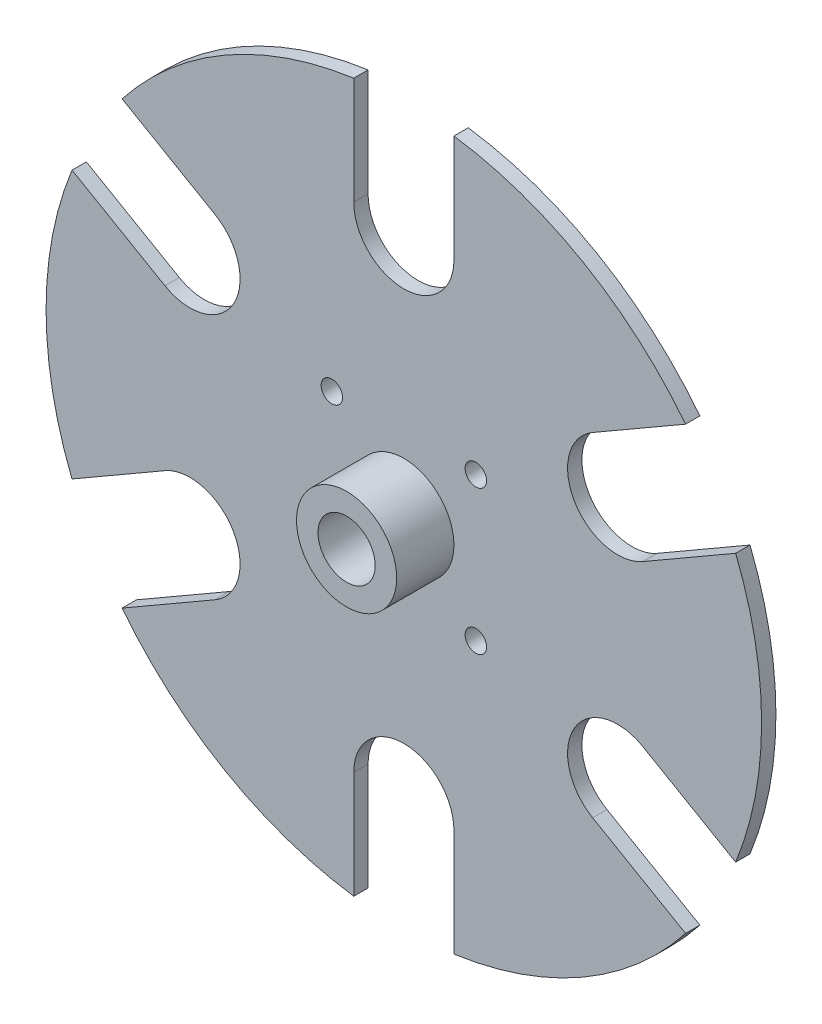
ISO-10303-21;
HEADER;
FILE_DESCRIPTION(('STEP AP214'),'2;1');
FILE_NAME('part.step','',(''),(''),'','','');
FILE_SCHEMA(('AUTOMOTIVE_DESIGN { 1 0 10303 214 1 1 1 1 }'));
ENDSEC;
DATA;
#1=APPLICATION_CONTEXT('core data for automotive mechanical design processes');
#2=APPLICATION_PROTOCOL_DEFINITION('international standard','automotive_design',2000,#1);
#3=PRODUCT_CONTEXT('',#1,'mechanical');
#4=PRODUCT('Part','Part','',(#3));
#5=PRODUCT_RELATED_PRODUCT_CATEGORY('part','',(#4));
#6=PRODUCT_DEFINITION_FORMATION('','',#4);
#7=PRODUCT_DEFINITION_CONTEXT('part definition',#1,'design');
#8=PRODUCT_DEFINITION('design','',#6,#7);
#9=PRODUCT_DEFINITION_SHAPE('','',#8);
#10=(LENGTH_UNIT() NAMED_UNIT(*) SI_UNIT(.MILLI.,.METRE.));
#11=(NAMED_UNIT(*) PLANE_ANGLE_UNIT() SI_UNIT($,.RADIAN.));
#12=(NAMED_UNIT(*) SI_UNIT($,.STERADIAN.) SOLID_ANGLE_UNIT());
#13=UNCERTAINTY_MEASURE_WITH_UNIT(LENGTH_MEASURE(1.E-05),#10,'distance_accuracy_value','');
#14=(GEOMETRIC_REPRESENTATION_CONTEXT(3) GLOBAL_UNCERTAINTY_ASSIGNED_CONTEXT((#13)) GLOBAL_UNIT_ASSIGNED_CONTEXT((#10,
#11,#12)) REPRESENTATION_CONTEXT('',''));
#15=CARTESIAN_POINT('',(0.,0.,0.));
#16=DIRECTION('',(0.,0.,1.));
#17=DIRECTION('',(1.,0.,0.));
#18=AXIS2_PLACEMENT_3D('',#15,#16,#17);
#19=CARTESIAN_POINT('',(0.,0.,7.));
#20=DIRECTION('',(0.,0.,-1.));
#21=DIRECTION('',(-1.,0.,0.));
#22=AXIS2_PLACEMENT_3D('',#19,#20,#21);
#23=CYLINDRICAL_SURFACE('',#22,50.);
#24=CARTESIAN_POINT('',(0.,0.,5.));
#25=DIRECTION('',(0.,0.,1.));
#26=DIRECTION('',(1.,0.,0.));
#27=AXIS2_PLACEMENT_3D('',#24,#25,#26);
#28=CIRCLE('',#27,50.);
#29=CARTESIAN_POINT('',(46.3748177838693,-18.6916097624823,5.));
#30=VERTEX_POINT('',#29);
#31=CARTESIAN_POINT('',(46.3748177838694,18.6916097624819,5.));
#32=VERTEX_POINT('',#31);
#33=EDGE_CURVE('E220',#30,#32,#28,.T.);
#34=ORIENTED_EDGE('',*,*,#33,.T.);
#35=DIRECTION('',(0.,0.,1.));
#36=VECTOR('',#35,1.);
#37=CARTESIAN_POINT('',(46.3748177838694,18.6916097624819,5.));
#38=LINE('',#37,#36);
#39=CARTESIAN_POINT('',(46.3748177838694,18.6916097624819,7.));
#40=VERTEX_POINT('',#39);
#41=EDGE_CURVE('E373',#32,#40,#38,.T.);
#42=ORIENTED_EDGE('',*,*,#41,.T.);
#43=CARTESIAN_POINT('',(0.,0.,7.));
#44=DIRECTION('',(0.,0.,1.));
#45=DIRECTION('',(1.,0.,0.));
#46=AXIS2_PLACEMENT_3D('',#43,#44,#45);
#47=CIRCLE('',#46,50.);
#48=CARTESIAN_POINT('',(46.3748177838693,-18.6916097624823,7.));
#49=VERTEX_POINT('',#48);
#50=EDGE_CURVE('E236',#49,#40,#47,.T.);
#51=ORIENTED_EDGE('',*,*,#50,.F.);
#52=DIRECTION('',(0.,0.,1.));
#53=VECTOR('',#52,1.);
#54=CARTESIAN_POINT('',(46.3748177838693,-18.6916097624823,5.));
#55=LINE('',#54,#53);
#56=EDGE_CURVE('E58',#30,#49,#55,.T.);
#57=ORIENTED_EDGE('',*,*,#56,.F.);
#58=EDGE_LOOP('',(#34,#42,#51,#57));
#59=FACE_BOUND('',#58,.T.);
#60=ADVANCED_FACE('F33',(#59),#23,.T.);
#61=CARTESIAN_POINT('',(6.99999999999966,-49.5075751779463,5.));
#62=VERTEX_POINT('',#61);
#63=CARTESIAN_POINT('',(39.3748177838692,-30.8159654154644,5.));
#64=VERTEX_POINT('',#63);
#65=EDGE_CURVE('E225',#62,#64,#28,.T.);
#66=ORIENTED_EDGE('',*,*,#65,.T.);
#67=DIRECTION('',(0.,0.,1.));
#68=VECTOR('',#67,1.);
#69=CARTESIAN_POINT('',(39.3748177838692,-30.8159654154644,5.));
#70=LINE('',#69,#68);
#71=CARTESIAN_POINT('',(39.3748177838692,-30.8159654154644,7.));
#72=VERTEX_POINT('',#71);
#73=EDGE_CURVE('E256',#64,#72,#70,.T.);
#74=ORIENTED_EDGE('',*,*,#73,.T.);
#75=CARTESIAN_POINT('',(6.99999999999966,-49.5075751779463,7.));
#76=VERTEX_POINT('',#75);
#77=EDGE_CURVE('E395',#76,#72,#47,.T.);
#78=ORIENTED_EDGE('',*,*,#77,.F.);
#79=DIRECTION('',(0.,0.,1.));
#80=VECTOR('',#79,1.);
#81=CARTESIAN_POINT('',(6.99999999999966,-49.5075751779463,5.));
#82=LINE('',#81,#80);
#83=EDGE_CURVE('E258',#62,#76,#82,.T.);
#84=ORIENTED_EDGE('',*,*,#83,.F.);
#85=EDGE_LOOP('',(#66,#74,#78,#84));
#86=FACE_BOUND('',#85,.T.);
#87=ADVANCED_FACE('F254',(#86),#23,.T.);
#88=CARTESIAN_POINT('',(-39.3748177838696,-30.8159654154638,5.));
#89=VERTEX_POINT('',#88);
#90=CARTESIAN_POINT('',(-7.00000000000035,-49.5075751779462,5.));
#91=VERTEX_POINT('',#90);
#92=EDGE_CURVE('E239',#89,#91,#28,.T.);
#93=ORIENTED_EDGE('',*,*,#92,.T.);
#94=DIRECTION('',(0.,0.,1.));
#95=VECTOR('',#94,1.);
#96=CARTESIAN_POINT('',(-7.00000000000035,-49.5075751779462,5.));
#97=LINE('',#96,#95);
#98=CARTESIAN_POINT('',(-7.00000000000035,-49.5075751779462,7.));
#99=VERTEX_POINT('',#98);
#100=EDGE_CURVE('E280',#91,#99,#97,.T.);
#101=ORIENTED_EDGE('',*,*,#100,.T.);
#102=CARTESIAN_POINT('',(-39.3748177838696,-30.8159654154638,7.));
#103=VERTEX_POINT('',#102);
#104=EDGE_CURVE('E390',#103,#99,#47,.T.);
#105=ORIENTED_EDGE('',*,*,#104,.F.);
#106=DIRECTION('',(0.,0.,1.));
#107=VECTOR('',#106,1.);
#108=CARTESIAN_POINT('',(-39.3748177838696,-30.8159654154638,5.));
#109=LINE('',#108,#107);
#110=EDGE_CURVE('E321',#89,#103,#109,.T.);
#111=ORIENTED_EDGE('',*,*,#110,.F.);
#112=EDGE_LOOP('',(#93,#101,#105,#111));
#113=FACE_BOUND('',#112,.T.);
#114=ADVANCED_FACE('F441',(#113),#23,.T.);
#115=CARTESIAN_POINT('',(-46.3748177838691,18.6916097624826,5.));
#116=VERTEX_POINT('',#115);
#117=CARTESIAN_POINT('',(-46.3748177838695,-18.6916097624816,5.));
#118=VERTEX_POINT('',#117);
#119=EDGE_CURVE('E231',#116,#118,#28,.T.);
#120=ORIENTED_EDGE('',*,*,#119,.T.);
#121=DIRECTION('',(0.,0.,1.));
#122=VECTOR('',#121,1.);
#123=CARTESIAN_POINT('',(-46.3748177838695,-18.6916097624816,5.));
#124=LINE('',#123,#122);
#125=CARTESIAN_POINT('',(-46.3748177838695,-18.6916097624816,7.));
#126=VERTEX_POINT('',#125);
#127=EDGE_CURVE('E301',#118,#126,#124,.T.);
#128=ORIENTED_EDGE('',*,*,#127,.T.);
#129=CARTESIAN_POINT('',(-46.3748177838691,18.6916097624826,7.));
#130=VERTEX_POINT('',#129);
#131=EDGE_CURVE('E382',#130,#126,#47,.T.);
#132=ORIENTED_EDGE('',*,*,#131,.F.);
#133=DIRECTION('',(0.,0.,1.));
#134=VECTOR('',#133,1.);
#135=CARTESIAN_POINT('',(-46.3748177838691,18.6916097624826,5.));
#136=LINE('',#135,#134);
#137=EDGE_CURVE('E346',#116,#130,#136,.T.);
#138=ORIENTED_EDGE('',*,*,#137,.F.);
#139=EDGE_LOOP('',(#120,#128,#132,#138));
#140=FACE_BOUND('',#139,.T.);
#141=ADVANCED_FACE('F457',(#140),#23,.T.);
#142=CARTESIAN_POINT('',(-7.,49.5075751779463,5.));
#143=VERTEX_POINT('',#142);
#144=CARTESIAN_POINT('',(-39.374817783869,30.8159654154647,5.));
#145=VERTEX_POINT('',#144);
#146=EDGE_CURVE('E223',#143,#145,#28,.T.);
#147=ORIENTED_EDGE('',*,*,#146,.T.);
#148=DIRECTION('',(0.,0.,1.));
#149=VECTOR('',#148,1.);
#150=CARTESIAN_POINT('',(-39.374817783869,30.8159654154647,5.));
#151=LINE('',#150,#149);
#152=CARTESIAN_POINT('',(-39.374817783869,30.8159654154647,7.));
#153=VERTEX_POINT('',#152);
#154=EDGE_CURVE('E326',#145,#153,#151,.T.);
#155=ORIENTED_EDGE('',*,*,#154,.T.);
#156=CARTESIAN_POINT('',(-7.,49.5075751779463,7.));
#157=VERTEX_POINT('',#156);
#158=EDGE_CURVE('E237',#157,#153,#47,.T.);
#159=ORIENTED_EDGE('',*,*,#158,.F.);
#160=DIRECTION('',(0.,0.,1.));
#161=VECTOR('',#160,1.);
#162=CARTESIAN_POINT('',(-7.,49.5075751779463,5.));
#163=LINE('',#162,#161);
#164=EDGE_CURVE('E368',#143,#157,#163,.T.);
#165=ORIENTED_EDGE('',*,*,#164,.F.);
#166=EDGE_LOOP('',(#147,#155,#159,#165));
#167=FACE_BOUND('',#166,.T.);
#168=ADVANCED_FACE('F445',(#167),#23,.T.);
#169=CARTESIAN_POINT('',(0.,0.,0.));
#170=DIRECTION('',(0.,0.,1.));
#171=DIRECTION('',(1.,0.,0.));
#172=AXIS2_PLACEMENT_3D('',#169,#170,#171);
#173=PLANE('',#172);
#174=CARTESIAN_POINT('',(0.,0.,0.));
#175=DIRECTION('',(0.,0.,1.));
#176=DIRECTION('',(1.,0.,0.));
#177=AXIS2_PLACEMENT_3D('',#174,#175,#176);
#178=CIRCLE('',#177,20.);
#179=CARTESIAN_POINT('',(20.,0.,0.));
#180=VERTEX_POINT('',#179);
#181=EDGE_CURVE('E42',#180,#180,#178,.T.);
#182=ORIENTED_EDGE('',*,*,#181,.F.);
#183=EDGE_LOOP('',(#182));
#184=FACE_BOUND('',#183,.T.);
#185=CARTESIAN_POINT('',(0.,0.,0.));
#186=DIRECTION('',(0.,0.,1.));
#187=DIRECTION('',(1.,0.,0.));
#188=AXIS2_PLACEMENT_3D('',#185,#186,#187);
#189=CIRCLE('',#188,4.);
#190=CARTESIAN_POINT('',(4.,0.,0.));
#191=VERTEX_POINT('',#190);
#192=EDGE_CURVE('E818',#191,#191,#189,.T.);
#193=ORIENTED_EDGE('',*,*,#192,.T.);
#194=EDGE_LOOP('',(#193));
#195=FACE_BOUND('',#194,.T.);
#196=CARTESIAN_POINT('',(-10.0619514030223,10.0619514030222,0.));
#197=DIRECTION('',(0.,0.,1.));
#198=DIRECTION('',(1.,0.,0.));
#199=AXIS2_PLACEMENT_3D('',#196,#197,#198);
#200=CIRCLE('',#199,1.5);
#201=CARTESIAN_POINT('',(-8.56195140302228,10.0619514030222,0.));
#202=VERTEX_POINT('',#201);
#203=EDGE_CURVE('E815',#202,#202,#200,.T.);
#204=ORIENTED_EDGE('',*,*,#203,.T.);
#205=EDGE_LOOP('',(#204));
#206=FACE_BOUND('',#205,.T.);
#207=CARTESIAN_POINT('',(10.0619514030223,10.0619514030222,0.));
#208=DIRECTION('',(0.,0.,1.));
#209=DIRECTION('',(-1.,0.,0.));
#210=AXIS2_PLACEMENT_3D('',#207,#208,#209);
#211=CIRCLE('',#210,1.5);
#212=CARTESIAN_POINT('',(8.56195140302228,10.0619514030222,0.));
#213=VERTEX_POINT('',#212);
#214=EDGE_CURVE('E808',#213,#213,#211,.T.);
#215=ORIENTED_EDGE('',*,*,#214,.T.);
#216=EDGE_LOOP('',(#215));
#217=FACE_BOUND('',#216,.T.);
#218=CARTESIAN_POINT('',(10.0619514030223,-10.0619514030222,0.));
#219=DIRECTION('',(0.,0.,1.));
#220=DIRECTION('',(1.,0.,0.));
#221=AXIS2_PLACEMENT_3D('',#218,#219,#220);
#222=CIRCLE('',#221,1.5);
#223=CARTESIAN_POINT('',(11.5619514030223,-10.0619514030222,0.));
#224=VERTEX_POINT('',#223);
#225=EDGE_CURVE('E804',#224,#224,#222,.T.);
#226=ORIENTED_EDGE('',*,*,#225,.T.);
#227=EDGE_LOOP('',(#226));
#228=FACE_BOUND('',#227,.T.);
#229=CARTESIAN_POINT('',(-10.0619514030223,-10.0619514030222,0.));
#230=DIRECTION('',(0.,0.,1.));
#231=DIRECTION('',(-1.,0.,0.));
#232=AXIS2_PLACEMENT_3D('',#229,#230,#231);
#233=CIRCLE('',#232,1.5);
#234=CARTESIAN_POINT('',(-11.5619514030223,-10.0619514030222,0.));
#235=VERTEX_POINT('',#234);
#236=EDGE_CURVE('E802',#235,#235,#233,.T.);
#237=ORIENTED_EDGE('',*,*,#236,.T.);
#238=EDGE_LOOP('',(#237));
#239=FACE_BOUND('',#238,.T.);
#240=ADVANCED_FACE('F456',(#184,#195,#206,#217,#228,#239),#173,.F.);
#241=CARTESIAN_POINT('',(0.,0.,5.));
#242=DIRECTION('',(0.,0.,-1.));
#243=DIRECTION('',(-1.,0.,0.));
#244=AXIS2_PLACEMENT_3D('',#241,#242,#243);
#245=CYLINDRICAL_SURFACE('',#244,20.);
#246=CARTESIAN_POINT('',(0.,0.,5.));
#247=DIRECTION('',(0.,0.,1.));
#248=DIRECTION('',(1.,0.,0.));
#249=AXIS2_PLACEMENT_3D('',#246,#247,#248);
#250=CIRCLE('',#249,20.);
#251=CARTESIAN_POINT('',(20.,0.,5.));
#252=VERTEX_POINT('',#251);
#253=EDGE_CURVE('E11',#252,#252,#250,.T.);
#254=ORIENTED_EDGE('',*,*,#253,.F.);
#255=EDGE_LOOP('',(#254));
#256=FACE_BOUND('',#255,.T.);
#257=ORIENTED_EDGE('',*,*,#181,.T.);
#258=EDGE_LOOP('',(#257));
#259=FACE_BOUND('',#258,.T.);
#260=ADVANCED_FACE('F35',(#256,#259),#245,.T.);
#261=CARTESIAN_POINT('',(0.,0.,5.));
#262=DIRECTION('',(0.,0.,-1.));
#263=DIRECTION('',(-1.,0.,0.));
#264=AXIS2_PLACEMENT_3D('',#261,#262,#263);
#265=CYLINDRICAL_SURFACE('',#264,4.);
#266=CARTESIAN_POINT('',(0.,0.,15.));
#267=DIRECTION('',(0.,0.,1.));
#268=DIRECTION('',(1.,0.,0.));
#269=AXIS2_PLACEMENT_3D('',#266,#267,#268);
#270=CIRCLE('',#269,4.);
#271=CARTESIAN_POINT('',(4.,0.,15.));
#272=VERTEX_POINT('',#271);
#273=EDGE_CURVE('E388',#272,#272,#270,.T.);
#274=ORIENTED_EDGE('',*,*,#273,.T.);
#275=EDGE_LOOP('',(#274));
#276=FACE_BOUND('',#275,.T.);
#277=ORIENTED_EDGE('',*,*,#192,.F.);
#278=EDGE_LOOP('',(#277));
#279=FACE_BOUND('',#278,.T.);
#280=ADVANCED_FACE('F495',(#276,#279),#265,.F.);
#281=CARTESIAN_POINT('',(-10.0619514030223,10.0619514030222,5.));
#282=DIRECTION('',(0.,0.,-1.));
#283=DIRECTION('',(-1.,0.,0.));
#284=AXIS2_PLACEMENT_3D('',#281,#282,#283);
#285=CYLINDRICAL_SURFACE('',#284,1.5);
#286=ORIENTED_EDGE('',*,*,#203,.F.);
#287=EDGE_LOOP('',(#286));
#288=FACE_BOUND('',#287,.T.);
#289=CARTESIAN_POINT('',(-10.0619514030223,10.0619514030222,7.));
#290=DIRECTION('',(0.,0.,1.));
#291=DIRECTION('',(1.,0.,0.));
#292=AXIS2_PLACEMENT_3D('',#289,#290,#291);
#293=CIRCLE('',#292,1.5);
#294=CARTESIAN_POINT('',(-8.56195140302228,10.0619514030222,7.));
#295=VERTEX_POINT('',#294);
#296=EDGE_CURVE('E736',#295,#295,#293,.T.);
#297=ORIENTED_EDGE('',*,*,#296,.T.);
#298=EDGE_LOOP('',(#297));
#299=FACE_BOUND('',#298,.T.);
#300=ADVANCED_FACE('F500',(#288,#299),#285,.F.);
#301=CARTESIAN_POINT('',(10.0619514030223,10.0619514030222,5.));
#302=DIRECTION('',(0.,0.,-1.));
#303=DIRECTION('',(-1.,0.,0.));
#304=AXIS2_PLACEMENT_3D('',#301,#302,#303);
#305=CYLINDRICAL_SURFACE('',#304,1.5);
#306=ORIENTED_EDGE('',*,*,#214,.F.);
#307=EDGE_LOOP('',(#306));
#308=FACE_BOUND('',#307,.T.);
#309=CARTESIAN_POINT('',(10.0619514030223,10.0619514030222,7.));
#310=DIRECTION('',(0.,0.,1.));
#311=DIRECTION('',(1.,0.,0.));
#312=AXIS2_PLACEMENT_3D('',#309,#310,#311);
#313=CIRCLE('',#312,1.5);
#314=CARTESIAN_POINT('',(11.5619514030223,10.0619514030222,7.));
#315=VERTEX_POINT('',#314);
#316=EDGE_CURVE('E351',#315,#315,#313,.T.);
#317=ORIENTED_EDGE('',*,*,#316,.T.);
#318=EDGE_LOOP('',(#317));
#319=FACE_BOUND('',#318,.T.);
#320=ADVANCED_FACE('F537',(#308,#319),#305,.F.);
#321=CARTESIAN_POINT('',(10.0619514030223,-10.0619514030222,5.));
#322=DIRECTION('',(0.,0.,-1.));
#323=DIRECTION('',(-1.,0.,0.));
#324=AXIS2_PLACEMENT_3D('',#321,#322,#323);
#325=CYLINDRICAL_SURFACE('',#324,1.5);
#326=ORIENTED_EDGE('',*,*,#225,.F.);
#327=EDGE_LOOP('',(#326));
#328=FACE_BOUND('',#327,.T.);
#329=CARTESIAN_POINT('',(10.0619514030223,-10.0619514030222,7.));
#330=DIRECTION('',(0.,0.,1.));
#331=DIRECTION('',(1.,0.,0.));
#332=AXIS2_PLACEMENT_3D('',#329,#330,#331);
#333=CIRCLE('',#332,1.5);
#334=CARTESIAN_POINT('',(11.5619514030223,-10.0619514030222,7.));
#335=VERTEX_POINT('',#334);
#336=EDGE_CURVE('E733',#335,#335,#333,.T.);
#337=ORIENTED_EDGE('',*,*,#336,.T.);
#338=EDGE_LOOP('',(#337));
#339=FACE_BOUND('',#338,.T.);
#340=ADVANCED_FACE('F549',(#328,#339),#325,.F.);
#341=CARTESIAN_POINT('',(-10.0619514030223,-10.0619514030222,5.));
#342=DIRECTION('',(0.,0.,-1.));
#343=DIRECTION('',(-1.,0.,0.));
#344=AXIS2_PLACEMENT_3D('',#341,#342,#343);
#345=CYLINDRICAL_SURFACE('',#344,1.5);
#346=ORIENTED_EDGE('',*,*,#236,.F.);
#347=EDGE_LOOP('',(#346));
#348=FACE_BOUND('',#347,.T.);
#349=CARTESIAN_POINT('',(-10.0619514030223,-10.0619514030222,7.));
#350=DIRECTION('',(0.,0.,1.));
#351=DIRECTION('',(1.,0.,0.));
#352=AXIS2_PLACEMENT_3D('',#349,#350,#351);
#353=CIRCLE('',#352,1.5);
#354=CARTESIAN_POINT('',(-8.56195140302228,-10.0619514030222,7.));
#355=VERTEX_POINT('',#354);
#356=EDGE_CURVE('E730',#355,#355,#353,.T.);
#357=ORIENTED_EDGE('',*,*,#356,.T.);
#358=EDGE_LOOP('',(#357));
#359=FACE_BOUND('',#358,.T.);
#360=ADVANCED_FACE('F512',(#348,#359),#345,.F.);
#361=CARTESIAN_POINT('',(0.,0.,15.));
#362=DIRECTION('',(0.,0.,1.));
#363=DIRECTION('',(1.,0.,0.));
#364=AXIS2_PLACEMENT_3D('',#361,#362,#363);
#365=PLANE('',#364);
#366=CARTESIAN_POINT('',(0.,0.,15.));
#367=DIRECTION('',(0.,0.,1.));
#368=DIRECTION('',(1.,0.,0.));
#369=AXIS2_PLACEMENT_3D('',#366,#367,#368);
#370=CIRCLE('',#369,7.);
#371=CARTESIAN_POINT('',(7.,0.,15.));
#372=VERTEX_POINT('',#371);
#373=EDGE_CURVE('E805',#372,#372,#370,.T.);
#374=ORIENTED_EDGE('',*,*,#373,.T.);
#375=EDGE_LOOP('',(#374));
#376=FACE_BOUND('',#375,.T.);
#377=ORIENTED_EDGE('',*,*,#273,.F.);
#378=EDGE_LOOP('',(#377));
#379=FACE_BOUND('',#378,.T.);
#380=ADVANCED_FACE('F486',(#376,#379),#365,.T.);
#381=CARTESIAN_POINT('',(0.,0.,15.));
#382=DIRECTION('',(0.,0.,-1.));
#383=DIRECTION('',(-1.,0.,0.));
#384=AXIS2_PLACEMENT_3D('',#381,#382,#383);
#385=CYLINDRICAL_SURFACE('',#384,7.);
#386=CARTESIAN_POINT('',(0.,0.,7.));
#387=DIRECTION('',(0.,0.,1.));
#388=DIRECTION('',(1.,0.,0.));
#389=AXIS2_PLACEMENT_3D('',#386,#387,#388);
#390=CIRCLE('',#389,7.);
#391=CARTESIAN_POINT('',(7.,0.,7.));
#392=VERTEX_POINT('',#391);
#393=EDGE_CURVE('E37',#392,#392,#390,.T.);
#394=ORIENTED_EDGE('',*,*,#393,.T.);
#395=EDGE_LOOP('',(#394));
#396=FACE_BOUND('',#395,.T.);
#397=ORIENTED_EDGE('',*,*,#373,.F.);
#398=EDGE_LOOP('',(#397));
#399=FACE_BOUND('',#398,.T.);
#400=ADVANCED_FACE('F453',(#396,#399),#385,.T.);
#401=CARTESIAN_POINT('',(0.,0.,5.));
#402=DIRECTION('',(0.,0.,1.));
#403=DIRECTION('',(1.,0.,0.));
#404=AXIS2_PLACEMENT_3D('',#401,#402,#403);
#405=PLANE('',#404);
#406=ORIENTED_EDGE('',*,*,#253,.T.);
#407=EDGE_LOOP('',(#406));
#408=FACE_BOUND('',#407,.T.);
#409=CARTESIAN_POINT('',(29.8844367271028,17.2537875889731,5.));
#410=DIRECTION('',(0.,0.,1.));
#411=DIRECTION('',(1.,0.,0.));
#412=AXIS2_PLACEMENT_3D('',#409,#410,#411);
#413=CIRCLE('',#412,7.);
#414=CARTESIAN_POINT('',(26.3844367271028,23.3159654154642,5.));
#415=VERTEX_POINT('',#414);
#416=CARTESIAN_POINT('',(33.3844367271028,11.1916097624821,5.));
#417=VERTEX_POINT('',#416);
#418=EDGE_CURVE('E203',#415,#417,#413,.T.);
#419=ORIENTED_EDGE('',*,*,#418,.T.);
#420=DIRECTION('',(0.866025403784443,0.499999999999993,0.));
#421=VECTOR('',#420,1.);
#422=CARTESIAN_POINT('',(46.3748177838694,18.6916097624819,5.));
#423=LINE('',#422,#421);
#424=EDGE_CURVE('E213',#417,#32,#423,.T.);
#425=ORIENTED_EDGE('',*,*,#424,.T.);
#426=ORIENTED_EDGE('',*,*,#33,.F.);
#427=DIRECTION('',(-0.866025403784431,0.500000000000013,0.));
#428=VECTOR('',#427,1.);
#429=CARTESIAN_POINT('',(46.3748177838693,-18.6916097624823,5.));
#430=LINE('',#429,#428);
#431=CARTESIAN_POINT('',(33.3844367271028,-11.1916097624821,5.));
#432=VERTEX_POINT('',#431);
#433=EDGE_CURVE('E273',#30,#432,#430,.T.);
#434=ORIENTED_EDGE('',*,*,#433,.T.);
#435=CARTESIAN_POINT('',(29.8844367271028,-17.2537875889731,5.));
#436=DIRECTION('',(0.,0.,1.));
#437=DIRECTION('',(1.,0.,0.));
#438=AXIS2_PLACEMENT_3D('',#435,#436,#437);
#439=CIRCLE('',#438,7.);
#440=CARTESIAN_POINT('',(26.3844367271028,-23.3159654154642,5.));
#441=VERTEX_POINT('',#440);
#442=EDGE_CURVE('E268',#432,#441,#439,.T.);
#443=ORIENTED_EDGE('',*,*,#442,.T.);
#444=DIRECTION('',(0.866025403784431,-0.500000000000014,0.));
#445=VECTOR('',#444,1.);
#446=CARTESIAN_POINT('',(39.3748177838692,-30.8159654154644,5.));
#447=LINE('',#446,#445);
#448=EDGE_CURVE('E265',#441,#64,#447,.T.);
#449=ORIENTED_EDGE('',*,*,#448,.T.);
#450=ORIENTED_EDGE('',*,*,#65,.F.);
#451=DIRECTION('',(0.,1.,0.));
#452=VECTOR('',#451,1.);
#453=CARTESIAN_POINT('',(6.99999999999966,-49.5075751779463,5.));
#454=LINE('',#453,#452);
#455=CARTESIAN_POINT('',(7.,-34.5075751779463,5.));
#456=VERTEX_POINT('',#455);
#457=EDGE_CURVE('E262',#62,#456,#454,.T.);
#458=ORIENTED_EDGE('',*,*,#457,.T.);
#459=CARTESIAN_POINT('',(0.,-34.5075751779463,5.));
#460=DIRECTION('',(0.,0.,1.));
#461=DIRECTION('',(1.,0.,0.));
#462=AXIS2_PLACEMENT_3D('',#459,#460,#461);
#463=CIRCLE('',#462,7.);
#464=CARTESIAN_POINT('',(-6.99999999999999,-34.5075751779463,5.));
#465=VERTEX_POINT('',#464);
#466=EDGE_CURVE('E291',#456,#465,#463,.T.);
#467=ORIENTED_EDGE('',*,*,#466,.T.);
#468=DIRECTION('',(0.,-1.,0.));
#469=VECTOR('',#468,1.);
#470=CARTESIAN_POINT('',(-7.00000000000035,-49.5075751779462,5.));
#471=LINE('',#470,#469);
#472=EDGE_CURVE('E294',#465,#91,#471,.T.);
#473=ORIENTED_EDGE('',*,*,#472,.T.);
#474=ORIENTED_EDGE('',*,*,#92,.F.);
#475=DIRECTION('',(0.866025403784455,0.499999999999972,0.));
#476=VECTOR('',#475,1.);
#477=CARTESIAN_POINT('',(-39.3748177838696,-30.8159654154638,5.));
#478=LINE('',#477,#476);
#479=CARTESIAN_POINT('',(-26.3844367271028,-23.3159654154642,5.));
#480=VERTEX_POINT('',#479);
#481=EDGE_CURVE('E311',#89,#480,#478,.T.);
#482=ORIENTED_EDGE('',*,*,#481,.T.);
#483=CARTESIAN_POINT('',(-29.8844367271028,-17.2537875889732,5.));
#484=DIRECTION('',(0.,0.,1.));
#485=DIRECTION('',(1.,0.,0.));
#486=AXIS2_PLACEMENT_3D('',#483,#484,#485);
#487=CIRCLE('',#486,7.);
#488=CARTESIAN_POINT('',(-33.3844367271028,-11.1916097624821,5.));
#489=VERTEX_POINT('',#488);
#490=EDGE_CURVE('E314',#480,#489,#487,.T.);
#491=ORIENTED_EDGE('',*,*,#490,.T.);
#492=DIRECTION('',(-0.866025403784455,-0.499999999999972,0.));
#493=VECTOR('',#492,1.);
#494=CARTESIAN_POINT('',(-46.3748177838695,-18.6916097624816,5.));
#495=LINE('',#494,#493);
#496=EDGE_CURVE('E318',#489,#118,#495,.T.);
#497=ORIENTED_EDGE('',*,*,#496,.T.);
#498=ORIENTED_EDGE('',*,*,#119,.F.);
#499=DIRECTION('',(0.866025403784419,-0.500000000000035,0.));
#500=VECTOR('',#499,1.);
#501=CARTESIAN_POINT('',(-46.3748177838691,18.6916097624826,5.));
#502=LINE('',#501,#500);
#503=CARTESIAN_POINT('',(-33.3844367271028,11.191609762482,5.));
#504=VERTEX_POINT('',#503);
#505=EDGE_CURVE('E336',#116,#504,#502,.T.);
#506=ORIENTED_EDGE('',*,*,#505,.T.);
#507=CARTESIAN_POINT('',(-29.8844367271028,17.2537875889731,5.));
#508=DIRECTION('',(0.,0.,1.));
#509=DIRECTION('',(1.,0.,0.));
#510=AXIS2_PLACEMENT_3D('',#507,#508,#509);
#511=CIRCLE('',#510,7.);
#512=CARTESIAN_POINT('',(-26.3844367271028,23.3159654154642,5.));
#513=VERTEX_POINT('',#512);
#514=EDGE_CURVE('E339',#504,#513,#511,.T.);
#515=ORIENTED_EDGE('',*,*,#514,.T.);
#516=DIRECTION('',(-0.866025403784419,0.500000000000035,0.));
#517=VECTOR('',#516,1.);
#518=CARTESIAN_POINT('',(-39.374817783869,30.8159654154647,5.));
#519=LINE('',#518,#517);
#520=EDGE_CURVE('E343',#513,#145,#519,.T.);
#521=ORIENTED_EDGE('',*,*,#520,.T.);
#522=ORIENTED_EDGE('',*,*,#146,.F.);
#523=DIRECTION('',(0.,-1.,0.));
#524=VECTOR('',#523,1.);
#525=CARTESIAN_POINT('',(-7.,49.5075751779463,5.));
#526=LINE('',#525,#524);
#527=CARTESIAN_POINT('',(-7.,34.5075751779463,5.));
#528=VERTEX_POINT('',#527);
#529=EDGE_CURVE('E361',#143,#528,#526,.T.);
#530=ORIENTED_EDGE('',*,*,#529,.T.);
#531=CARTESIAN_POINT('',(0.,34.5075751779463,5.));
#532=DIRECTION('',(0.,0.,1.));
#533=DIRECTION('',(1.,0.,0.));
#534=AXIS2_PLACEMENT_3D('',#531,#532,#533);
#535=CIRCLE('',#534,7.);
#536=CARTESIAN_POINT('',(6.99999999999999,34.5075751779463,5.));
#537=VERTEX_POINT('',#536);
#538=EDGE_CURVE('E364',#528,#537,#535,.T.);
#539=ORIENTED_EDGE('',*,*,#538,.T.);
#540=DIRECTION('',(0.,1.,0.));
#541=VECTOR('',#540,1.);
#542=CARTESIAN_POINT('',(7.,49.5075751779463,5.));
#543=LINE('',#542,#541);
#544=CARTESIAN_POINT('',(7.,49.5075751779463,5.));
#545=VERTEX_POINT('',#544);
#546=EDGE_CURVE('E219',#537,#545,#543,.T.);
#547=ORIENTED_EDGE('',*,*,#546,.T.);
#548=CARTESIAN_POINT('',(39.3748177838694,30.8159654154641,5.));
#549=VERTEX_POINT('',#548);
#550=EDGE_CURVE('E210',#549,#545,#28,.T.);
#551=ORIENTED_EDGE('',*,*,#550,.F.);
#552=DIRECTION('',(-0.866025403784443,-0.499999999999993,0.));
#553=VECTOR('',#552,1.);
#554=CARTESIAN_POINT('',(39.3748177838694,30.8159654154641,5.));
#555=LINE('',#554,#553);
#556=EDGE_CURVE('E196',#549,#415,#555,.T.);
#557=ORIENTED_EDGE('',*,*,#556,.T.);
#558=EDGE_LOOP('',(#419,#425,#426,#434,#443,#449,#450,#458,#467,#473,#474,#482,#491,#497,#498,
#506,#515,#521,#522,#530,#539,#547,#551,#557));
#559=FACE_BOUND('',#558,.T.);
#560=ADVANCED_FACE('F216',(#408,#559),#405,.F.);
#561=CARTESIAN_POINT('',(39.3748177838694,30.8159654154641,7.));
#562=VERTEX_POINT('',#561);
#563=CARTESIAN_POINT('',(7.,49.5075751779463,7.));
#564=VERTEX_POINT('',#563);
#565=EDGE_CURVE('E212',#562,#564,#47,.T.);
#566=ORIENTED_EDGE('',*,*,#565,.F.);
#567=DIRECTION('',(0.,0.,1.));
#568=VECTOR('',#567,1.);
#569=CARTESIAN_POINT('',(39.3748177838694,30.8159654154641,5.));
#570=LINE('',#569,#568);
#571=EDGE_CURVE('E50',#549,#562,#570,.T.);
#572=ORIENTED_EDGE('',*,*,#571,.F.);
#573=ORIENTED_EDGE('',*,*,#550,.T.);
#574=DIRECTION('',(0.,0.,1.));
#575=VECTOR('',#574,1.);
#576=CARTESIAN_POINT('',(7.,49.5075751779463,5.));
#577=LINE('',#576,#575);
#578=EDGE_CURVE('E221',#545,#564,#577,.T.);
#579=ORIENTED_EDGE('',*,*,#578,.T.);
#580=EDGE_LOOP('',(#566,#572,#573,#579));
#581=FACE_BOUND('',#580,.T.);
#582=ADVANCED_FACE('F208',(#581),#23,.T.);
#583=CARTESIAN_POINT('',(0.,0.,7.));
#584=DIRECTION('',(0.,0.,1.));
#585=DIRECTION('',(1.,0.,0.));
#586=AXIS2_PLACEMENT_3D('',#583,#584,#585);
#587=PLANE('',#586);
#588=ORIENTED_EDGE('',*,*,#336,.F.);
#589=EDGE_LOOP('',(#588));
#590=FACE_BOUND('',#589,.T.);
#591=ORIENTED_EDGE('',*,*,#296,.F.);
#592=EDGE_LOOP('',(#591));
#593=FACE_BOUND('',#592,.T.);
#594=ORIENTED_EDGE('',*,*,#356,.F.);
#595=EDGE_LOOP('',(#594));
#596=FACE_BOUND('',#595,.T.);
#597=ORIENTED_EDGE('',*,*,#316,.F.);
#598=EDGE_LOOP('',(#597));
#599=FACE_BOUND('',#598,.T.);
#600=DIRECTION('',(0.866025403784443,0.499999999999993,0.));
#601=VECTOR('',#600,1.);
#602=CARTESIAN_POINT('',(46.3748177838694,18.6916097624819,7.));
#603=LINE('',#602,#601);
#604=CARTESIAN_POINT('',(33.3844367271028,11.1916097624821,7.));
#605=VERTEX_POINT('',#604);
#606=EDGE_CURVE('E204',#605,#40,#603,.T.);
#607=ORIENTED_EDGE('',*,*,#606,.F.);
#608=CARTESIAN_POINT('',(29.8844367271028,17.2537875889731,7.));
#609=DIRECTION('',(0.,0.,1.));
#610=DIRECTION('',(1.,0.,0.));
#611=AXIS2_PLACEMENT_3D('',#608,#609,#610);
#612=CIRCLE('',#611,7.);
#613=CARTESIAN_POINT('',(26.3844367271028,23.3159654154642,7.));
#614=VERTEX_POINT('',#613);
#615=EDGE_CURVE('E723',#614,#605,#612,.T.);
#616=ORIENTED_EDGE('',*,*,#615,.F.);
#617=DIRECTION('',(-0.866025403784443,-0.499999999999993,0.));
#618=VECTOR('',#617,1.);
#619=CARTESIAN_POINT('',(39.3748177838694,30.8159654154641,7.));
#620=LINE('',#619,#618);
#621=EDGE_CURVE('E286',#562,#614,#620,.T.);
#622=ORIENTED_EDGE('',*,*,#621,.F.);
#623=ORIENTED_EDGE('',*,*,#565,.T.);
#624=DIRECTION('',(0.,1.,0.));
#625=VECTOR('',#624,1.);
#626=CARTESIAN_POINT('',(7.,49.5075751779463,7.));
#627=LINE('',#626,#625);
#628=CARTESIAN_POINT('',(6.99999999999999,34.5075751779463,7.));
#629=VERTEX_POINT('',#628);
#630=EDGE_CURVE('E365',#629,#564,#627,.T.);
#631=ORIENTED_EDGE('',*,*,#630,.F.);
#632=CARTESIAN_POINT('',(0.,34.5075751779463,7.));
#633=DIRECTION('',(0.,0.,1.));
#634=DIRECTION('',(1.,0.,0.));
#635=AXIS2_PLACEMENT_3D('',#632,#633,#634);
#636=CIRCLE('',#635,7.);
#637=CARTESIAN_POINT('',(-7.,34.5075751779463,7.));
#638=VERTEX_POINT('',#637);
#639=EDGE_CURVE('E372',#638,#629,#636,.T.);
#640=ORIENTED_EDGE('',*,*,#639,.F.);
#641=DIRECTION('',(0.,-1.,0.));
#642=VECTOR('',#641,1.);
#643=CARTESIAN_POINT('',(-7.,49.5075751779463,7.));
#644=LINE('',#643,#642);
#645=EDGE_CURVE('E369',#157,#638,#644,.T.);
#646=ORIENTED_EDGE('',*,*,#645,.F.);
#647=ORIENTED_EDGE('',*,*,#158,.T.);
#648=DIRECTION('',(-0.866025403784419,0.500000000000035,0.));
#649=VECTOR('',#648,1.);
#650=CARTESIAN_POINT('',(-39.374817783869,30.8159654154647,7.));
#651=LINE('',#650,#649);
#652=CARTESIAN_POINT('',(-26.3844367271028,23.3159654154642,7.));
#653=VERTEX_POINT('',#652);
#654=EDGE_CURVE('E340',#653,#153,#651,.T.);
#655=ORIENTED_EDGE('',*,*,#654,.F.);
#656=CARTESIAN_POINT('',(-29.8844367271028,17.2537875889731,7.));
#657=DIRECTION('',(0.,0.,1.));
#658=DIRECTION('',(1.,0.,0.));
#659=AXIS2_PLACEMENT_3D('',#656,#657,#658);
#660=CIRCLE('',#659,7.);
#661=CARTESIAN_POINT('',(-33.3844367271028,11.191609762482,7.));
#662=VERTEX_POINT('',#661);
#663=EDGE_CURVE('E350',#662,#653,#660,.T.);
#664=ORIENTED_EDGE('',*,*,#663,.F.);
#665=DIRECTION('',(0.866025403784419,-0.500000000000035,0.));
#666=VECTOR('',#665,1.);
#667=CARTESIAN_POINT('',(-46.3748177838691,18.6916097624826,7.));
#668=LINE('',#667,#666);
#669=EDGE_CURVE('E347',#130,#662,#668,.T.);
#670=ORIENTED_EDGE('',*,*,#669,.F.);
#671=ORIENTED_EDGE('',*,*,#131,.T.);
#672=DIRECTION('',(-0.866025403784455,-0.499999999999972,0.));
#673=VECTOR('',#672,1.);
#674=CARTESIAN_POINT('',(-46.3748177838695,-18.6916097624816,7.));
#675=LINE('',#674,#673);
#676=CARTESIAN_POINT('',(-33.3844367271028,-11.1916097624821,7.));
#677=VERTEX_POINT('',#676);
#678=EDGE_CURVE('E315',#677,#126,#675,.T.);
#679=ORIENTED_EDGE('',*,*,#678,.F.);
#680=CARTESIAN_POINT('',(-29.8844367271028,-17.2537875889732,7.));
#681=DIRECTION('',(0.,0.,1.));
#682=DIRECTION('',(1.,0.,0.));
#683=AXIS2_PLACEMENT_3D('',#680,#681,#682);
#684=CIRCLE('',#683,7.);
#685=CARTESIAN_POINT('',(-26.3844367271028,-23.3159654154642,7.));
#686=VERTEX_POINT('',#685);
#687=EDGE_CURVE('E325',#686,#677,#684,.T.);
#688=ORIENTED_EDGE('',*,*,#687,.F.);
#689=DIRECTION('',(0.866025403784455,0.499999999999972,0.));
#690=VECTOR('',#689,1.);
#691=CARTESIAN_POINT('',(-39.3748177838696,-30.8159654154638,7.));
#692=LINE('',#691,#690);
#693=EDGE_CURVE('E322',#103,#686,#692,.T.);
#694=ORIENTED_EDGE('',*,*,#693,.F.);
#695=ORIENTED_EDGE('',*,*,#104,.T.);
#696=DIRECTION('',(0.,-1.,0.));
#697=VECTOR('',#696,1.);
#698=CARTESIAN_POINT('',(-7.00000000000035,-49.5075751779462,7.));
#699=LINE('',#698,#697);
#700=CARTESIAN_POINT('',(-6.99999999999999,-34.5075751779463,7.));
#701=VERTEX_POINT('',#700);
#702=EDGE_CURVE('E292',#701,#99,#699,.T.);
#703=ORIENTED_EDGE('',*,*,#702,.F.);
#704=CARTESIAN_POINT('',(0.,-34.5075751779463,7.));
#705=DIRECTION('',(0.,0.,1.));
#706=DIRECTION('',(1.,0.,0.));
#707=AXIS2_PLACEMENT_3D('',#704,#705,#706);
#708=CIRCLE('',#707,7.);
#709=CARTESIAN_POINT('',(7.,-34.5075751779463,7.));
#710=VERTEX_POINT('',#709);
#711=EDGE_CURVE('E300',#710,#701,#708,.T.);
#712=ORIENTED_EDGE('',*,*,#711,.F.);
#713=DIRECTION('',(0.,1.,0.));
#714=VECTOR('',#713,1.);
#715=CARTESIAN_POINT('',(6.99999999999966,-49.5075751779463,7.));
#716=LINE('',#715,#714);
#717=EDGE_CURVE('E297',#76,#710,#716,.T.);
#718=ORIENTED_EDGE('',*,*,#717,.F.);
#719=ORIENTED_EDGE('',*,*,#77,.T.);
#720=DIRECTION('',(0.866025403784431,-0.500000000000014,0.));
#721=VECTOR('',#720,1.);
#722=CARTESIAN_POINT('',(39.3748177838692,-30.8159654154644,7.));
#723=LINE('',#722,#721);
#724=CARTESIAN_POINT('',(26.3844367271028,-23.3159654154642,7.));
#725=VERTEX_POINT('',#724);
#726=EDGE_CURVE('E283',#725,#72,#723,.T.);
#727=ORIENTED_EDGE('',*,*,#726,.F.);
#728=CARTESIAN_POINT('',(29.8844367271028,-17.2537875889731,7.));
#729=DIRECTION('',(0.,0.,1.));
#730=DIRECTION('',(1.,0.,0.));
#731=AXIS2_PLACEMENT_3D('',#728,#729,#730);
#732=CIRCLE('',#731,7.);
#733=CARTESIAN_POINT('',(33.3844367271028,-11.1916097624821,7.));
#734=VERTEX_POINT('',#733);
#735=EDGE_CURVE('E279',#734,#725,#732,.T.);
#736=ORIENTED_EDGE('',*,*,#735,.F.);
#737=DIRECTION('',(-0.866025403784431,0.500000000000013,0.));
#738=VECTOR('',#737,1.);
#739=CARTESIAN_POINT('',(46.3748177838693,-18.6916097624823,7.));
#740=LINE('',#739,#738);
#741=EDGE_CURVE('E277',#49,#734,#740,.T.);
#742=ORIENTED_EDGE('',*,*,#741,.F.);
#743=ORIENTED_EDGE('',*,*,#50,.T.);
#744=EDGE_LOOP('',(#607,#616,#622,#623,#631,#640,#646,#647,#655,#664,#670,#671,#679,#688,#694,
#695,#703,#712,#718,#719,#727,#736,#742,#743));
#745=FACE_BOUND('',#744,.T.);
#746=ORIENTED_EDGE('',*,*,#393,.F.);
#747=EDGE_LOOP('',(#746));
#748=FACE_BOUND('',#747,.T.);
#749=ADVANCED_FACE('F404',(#590,#593,#596,#599,#745,#748),#587,.T.);
#750=CARTESIAN_POINT('',(7.,49.5075751779463,5.));
#751=DIRECTION('',(1.,0.,0.));
#752=DIRECTION('',(0.,1.,0.));
#753=AXIS2_PLACEMENT_3D('',#750,#751,#752);
#754=PLANE('',#753);
#755=ORIENTED_EDGE('',*,*,#630,.T.);
#756=ORIENTED_EDGE('',*,*,#578,.F.);
#757=ORIENTED_EDGE('',*,*,#546,.F.);
#758=DIRECTION('',(0.,0.,1.));
#759=VECTOR('',#758,1.);
#760=CARTESIAN_POINT('',(6.99999999999999,34.5075751779463,5.));
#761=LINE('',#760,#759);
#762=EDGE_CURVE('E226',#537,#629,#761,.T.);
#763=ORIENTED_EDGE('',*,*,#762,.T.);
#764=EDGE_LOOP('',(#755,#756,#757,#763));
#765=FACE_BOUND('',#764,.T.);
#766=ADVANCED_FACE('F450',(#765),#754,.F.);
#767=CARTESIAN_POINT('',(0.,34.5075751779463,5.));
#768=DIRECTION('',(0.,0.,1.));
#769=DIRECTION('',(1.,0.,0.));
#770=AXIS2_PLACEMENT_3D('',#767,#768,#769);
#771=CYLINDRICAL_SURFACE('',#770,7.);
#772=ORIENTED_EDGE('',*,*,#639,.T.);
#773=ORIENTED_EDGE('',*,*,#762,.F.);
#774=ORIENTED_EDGE('',*,*,#538,.F.);
#775=DIRECTION('',(0.,0.,1.));
#776=VECTOR('',#775,1.);
#777=CARTESIAN_POINT('',(-7.,34.5075751779463,5.));
#778=LINE('',#777,#776);
#779=EDGE_CURVE('E379',#528,#638,#778,.T.);
#780=ORIENTED_EDGE('',*,*,#779,.T.);
#781=EDGE_LOOP('',(#772,#773,#774,#780));
#782=FACE_BOUND('',#781,.T.);
#783=ADVANCED_FACE('F587',(#782),#771,.F.);
#784=CARTESIAN_POINT('',(-7.,49.5075751779463,5.));
#785=DIRECTION('',(-1.,0.,0.));
#786=DIRECTION('',(0.,-1.,0.));
#787=AXIS2_PLACEMENT_3D('',#784,#785,#786);
#788=PLANE('',#787);
#789=ORIENTED_EDGE('',*,*,#645,.T.);
#790=ORIENTED_EDGE('',*,*,#779,.F.);
#791=ORIENTED_EDGE('',*,*,#529,.F.);
#792=ORIENTED_EDGE('',*,*,#164,.T.);
#793=EDGE_LOOP('',(#789,#790,#791,#792));
#794=FACE_BOUND('',#793,.T.);
#795=ADVANCED_FACE('F594',(#794),#788,.F.);
#796=CARTESIAN_POINT('',(-39.374817783869,30.8159654154647,5.));
#797=DIRECTION('',(0.500000000000035,0.866025403784419,0.));
#798=DIRECTION('',(-0.866025403784419,0.500000000000035,0.));
#799=AXIS2_PLACEMENT_3D('',#796,#797,#798);
#800=PLANE('',#799);
#801=ORIENTED_EDGE('',*,*,#654,.T.);
#802=ORIENTED_EDGE('',*,*,#154,.F.);
#803=ORIENTED_EDGE('',*,*,#520,.F.);
#804=DIRECTION('',(0.,0.,1.));
#805=VECTOR('',#804,1.);
#806=CARTESIAN_POINT('',(-26.3844367271028,23.3159654154642,5.));
#807=LINE('',#806,#805);
#808=EDGE_CURVE('E356',#513,#653,#807,.T.);
#809=ORIENTED_EDGE('',*,*,#808,.T.);
#810=EDGE_LOOP('',(#801,#802,#803,#809));
#811=FACE_BOUND('',#810,.T.);
#812=ADVANCED_FACE('F602',(#811),#800,.F.);
#813=CARTESIAN_POINT('',(-29.8844367271028,17.2537875889731,5.));
#814=DIRECTION('',(0.,0.,1.));
#815=DIRECTION('',(1.,0.,0.));
#816=AXIS2_PLACEMENT_3D('',#813,#814,#815);
#817=CYLINDRICAL_SURFACE('',#816,7.);
#818=ORIENTED_EDGE('',*,*,#663,.T.);
#819=ORIENTED_EDGE('',*,*,#808,.F.);
#820=ORIENTED_EDGE('',*,*,#514,.F.);
#821=DIRECTION('',(0.,0.,1.));
#822=VECTOR('',#821,1.);
#823=CARTESIAN_POINT('',(-33.3844367271028,11.191609762482,5.));
#824=LINE('',#823,#822);
#825=EDGE_CURVE('E358',#504,#662,#824,.T.);
#826=ORIENTED_EDGE('',*,*,#825,.T.);
#827=EDGE_LOOP('',(#818,#819,#820,#826));
#828=FACE_BOUND('',#827,.T.);
#829=ADVANCED_FACE('F610',(#828),#817,.F.);
#830=CARTESIAN_POINT('',(-46.3748177838691,18.6916097624826,5.));
#831=DIRECTION('',(-0.500000000000035,-0.866025403784419,0.));
#832=DIRECTION('',(0.866025403784419,-0.500000000000035,0.));
#833=AXIS2_PLACEMENT_3D('',#830,#831,#832);
#834=PLANE('',#833);
#835=ORIENTED_EDGE('',*,*,#669,.T.);
#836=ORIENTED_EDGE('',*,*,#825,.F.);
#837=ORIENTED_EDGE('',*,*,#505,.F.);
#838=ORIENTED_EDGE('',*,*,#137,.T.);
#839=EDGE_LOOP('',(#835,#836,#837,#838));
#840=FACE_BOUND('',#839,.T.);
#841=ADVANCED_FACE('F618',(#840),#834,.F.);
#842=CARTESIAN_POINT('',(-46.3748177838695,-18.6916097624816,5.));
#843=DIRECTION('',(-0.499999999999972,0.866025403784455,0.));
#844=DIRECTION('',(-0.866025403784455,-0.499999999999972,0.));
#845=AXIS2_PLACEMENT_3D('',#842,#843,#844);
#846=PLANE('',#845);
#847=ORIENTED_EDGE('',*,*,#678,.T.);
#848=ORIENTED_EDGE('',*,*,#127,.F.);
#849=ORIENTED_EDGE('',*,*,#496,.F.);
#850=DIRECTION('',(0.,0.,1.));
#851=VECTOR('',#850,1.);
#852=CARTESIAN_POINT('',(-33.3844367271028,-11.1916097624821,5.));
#853=LINE('',#852,#851);
#854=EDGE_CURVE('E331',#489,#677,#853,.T.);
#855=ORIENTED_EDGE('',*,*,#854,.T.);
#856=EDGE_LOOP('',(#847,#848,#849,#855));
#857=FACE_BOUND('',#856,.T.);
#858=ADVANCED_FACE('F626',(#857),#846,.F.);
#859=CARTESIAN_POINT('',(-29.8844367271028,-17.2537875889732,5.));
#860=DIRECTION('',(0.,0.,1.));
#861=DIRECTION('',(1.,0.,0.));
#862=AXIS2_PLACEMENT_3D('',#859,#860,#861);
#863=CYLINDRICAL_SURFACE('',#862,7.);
#864=ORIENTED_EDGE('',*,*,#687,.T.);
#865=ORIENTED_EDGE('',*,*,#854,.F.);
#866=ORIENTED_EDGE('',*,*,#490,.F.);
#867=DIRECTION('',(0.,0.,1.));
#868=VECTOR('',#867,1.);
#869=CARTESIAN_POINT('',(-26.3844367271028,-23.3159654154642,5.));
#870=LINE('',#869,#868);
#871=EDGE_CURVE('E333',#480,#686,#870,.T.);
#872=ORIENTED_EDGE('',*,*,#871,.T.);
#873=EDGE_LOOP('',(#864,#865,#866,#872));
#874=FACE_BOUND('',#873,.T.);
#875=ADVANCED_FACE('F634',(#874),#863,.F.);
#876=CARTESIAN_POINT('',(-39.3748177838696,-30.8159654154638,5.));
#877=DIRECTION('',(0.499999999999972,-0.866025403784455,0.));
#878=DIRECTION('',(0.866025403784455,0.499999999999972,0.));
#879=AXIS2_PLACEMENT_3D('',#876,#877,#878);
#880=PLANE('',#879);
#881=ORIENTED_EDGE('',*,*,#693,.T.);
#882=ORIENTED_EDGE('',*,*,#871,.F.);
#883=ORIENTED_EDGE('',*,*,#481,.F.);
#884=ORIENTED_EDGE('',*,*,#110,.T.);
#885=EDGE_LOOP('',(#881,#882,#883,#884));
#886=FACE_BOUND('',#885,.T.);
#887=ADVANCED_FACE('F642',(#886),#880,.F.);
#888=CARTESIAN_POINT('',(-7.00000000000035,-49.5075751779462,5.));
#889=DIRECTION('',(-1.,0.,0.));
#890=DIRECTION('',(0.,-1.,0.));
#891=AXIS2_PLACEMENT_3D('',#888,#889,#890);
#892=PLANE('',#891);
#893=ORIENTED_EDGE('',*,*,#702,.T.);
#894=ORIENTED_EDGE('',*,*,#100,.F.);
#895=ORIENTED_EDGE('',*,*,#472,.F.);
#896=DIRECTION('',(0.,0.,1.));
#897=VECTOR('',#896,1.);
#898=CARTESIAN_POINT('',(-6.99999999999999,-34.5075751779463,5.));
#899=LINE('',#898,#897);
#900=EDGE_CURVE('E306',#465,#701,#899,.T.);
#901=ORIENTED_EDGE('',*,*,#900,.T.);
#902=EDGE_LOOP('',(#893,#894,#895,#901));
#903=FACE_BOUND('',#902,.T.);
#904=ADVANCED_FACE('F650',(#903),#892,.F.);
#905=CARTESIAN_POINT('',(0.,-34.5075751779463,5.));
#906=DIRECTION('',(0.,0.,1.));
#907=DIRECTION('',(1.,0.,0.));
#908=AXIS2_PLACEMENT_3D('',#905,#906,#907);
#909=CYLINDRICAL_SURFACE('',#908,7.);
#910=ORIENTED_EDGE('',*,*,#711,.T.);
#911=ORIENTED_EDGE('',*,*,#900,.F.);
#912=ORIENTED_EDGE('',*,*,#466,.F.);
#913=DIRECTION('',(0.,0.,1.));
#914=VECTOR('',#913,1.);
#915=CARTESIAN_POINT('',(7.,-34.5075751779463,5.));
#916=LINE('',#915,#914);
#917=EDGE_CURVE('E308',#456,#710,#916,.T.);
#918=ORIENTED_EDGE('',*,*,#917,.T.);
#919=EDGE_LOOP('',(#910,#911,#912,#918));
#920=FACE_BOUND('',#919,.T.);
#921=ADVANCED_FACE('F432',(#920),#909,.F.);
#922=CARTESIAN_POINT('',(6.99999999999966,-49.5075751779463,5.));
#923=DIRECTION('',(1.,0.,0.));
#924=DIRECTION('',(0.,1.,0.));
#925=AXIS2_PLACEMENT_3D('',#922,#923,#924);
#926=PLANE('',#925);
#927=ORIENTED_EDGE('',*,*,#717,.T.);
#928=ORIENTED_EDGE('',*,*,#917,.F.);
#929=ORIENTED_EDGE('',*,*,#457,.F.);
#930=ORIENTED_EDGE('',*,*,#83,.T.);
#931=EDGE_LOOP('',(#927,#928,#929,#930));
#932=FACE_BOUND('',#931,.T.);
#933=ADVANCED_FACE('F425',(#932),#926,.F.);
#934=CARTESIAN_POINT('',(39.3748177838692,-30.8159654154644,5.));
#935=DIRECTION('',(-0.500000000000014,-0.866025403784431,0.));
#936=DIRECTION('',(0.866025403784431,-0.500000000000014,0.));
#937=AXIS2_PLACEMENT_3D('',#934,#935,#936);
#938=PLANE('',#937);
#939=ORIENTED_EDGE('',*,*,#726,.T.);
#940=ORIENTED_EDGE('',*,*,#73,.F.);
#941=ORIENTED_EDGE('',*,*,#448,.F.);
#942=DIRECTION('',(0.,0.,1.));
#943=VECTOR('',#942,1.);
#944=CARTESIAN_POINT('',(26.3844367271028,-23.3159654154642,5.));
#945=LINE('',#944,#943);
#946=EDGE_CURVE('E287',#441,#725,#945,.T.);
#947=ORIENTED_EDGE('',*,*,#946,.T.);
#948=EDGE_LOOP('',(#939,#940,#941,#947));
#949=FACE_BOUND('',#948,.T.);
#950=ADVANCED_FACE('F423',(#949),#938,.F.);
#951=CARTESIAN_POINT('',(29.8844367271028,-17.2537875889731,5.));
#952=DIRECTION('',(0.,0.,1.));
#953=DIRECTION('',(1.,0.,0.));
#954=AXIS2_PLACEMENT_3D('',#951,#952,#953);
#955=CYLINDRICAL_SURFACE('',#954,7.);
#956=ORIENTED_EDGE('',*,*,#735,.T.);
#957=ORIENTED_EDGE('',*,*,#946,.F.);
#958=ORIENTED_EDGE('',*,*,#442,.F.);
#959=DIRECTION('',(0.,0.,1.));
#960=VECTOR('',#959,1.);
#961=CARTESIAN_POINT('',(33.3844367271028,-11.1916097624821,5.));
#962=LINE('',#961,#960);
#963=EDGE_CURVE('E271',#432,#734,#962,.T.);
#964=ORIENTED_EDGE('',*,*,#963,.T.);
#965=EDGE_LOOP('',(#956,#957,#958,#964));
#966=FACE_BOUND('',#965,.T.);
#967=ADVANCED_FACE('F422',(#966),#955,.F.);
#968=CARTESIAN_POINT('',(46.3748177838693,-18.6916097624823,5.));
#969=DIRECTION('',(0.500000000000013,0.866025403784431,0.));
#970=DIRECTION('',(-0.866025403784431,0.500000000000013,0.));
#971=AXIS2_PLACEMENT_3D('',#968,#969,#970);
#972=PLANE('',#971);
#973=ORIENTED_EDGE('',*,*,#741,.T.);
#974=ORIENTED_EDGE('',*,*,#963,.F.);
#975=ORIENTED_EDGE('',*,*,#433,.F.);
#976=ORIENTED_EDGE('',*,*,#56,.T.);
#977=EDGE_LOOP('',(#973,#974,#975,#976));
#978=FACE_BOUND('',#977,.T.);
#979=ADVANCED_FACE('F420',(#978),#972,.F.);
#980=CARTESIAN_POINT('',(46.3748177838694,18.6916097624819,5.));
#981=DIRECTION('',(0.499999999999993,-0.866025403784443,0.));
#982=DIRECTION('',(0.866025403784443,0.499999999999993,0.));
#983=AXIS2_PLACEMENT_3D('',#980,#981,#982);
#984=PLANE('',#983);
#985=ORIENTED_EDGE('',*,*,#606,.T.);
#986=ORIENTED_EDGE('',*,*,#41,.F.);
#987=ORIENTED_EDGE('',*,*,#424,.F.);
#988=DIRECTION('',(0.,0.,1.));
#989=VECTOR('',#988,1.);
#990=CARTESIAN_POINT('',(33.3844367271028,11.1916097624821,5.));
#991=LINE('',#990,#989);
#992=EDGE_CURVE('E414',#417,#605,#991,.T.);
#993=ORIENTED_EDGE('',*,*,#992,.T.);
#994=EDGE_LOOP('',(#985,#986,#987,#993));
#995=FACE_BOUND('',#994,.T.);
#996=ADVANCED_FACE('F689',(#995),#984,.F.);
#997=CARTESIAN_POINT('',(29.8844367271028,17.2537875889731,5.));
#998=DIRECTION('',(0.,0.,1.));
#999=DIRECTION('',(1.,0.,0.));
#1000=AXIS2_PLACEMENT_3D('',#997,#998,#999);
#1001=CYLINDRICAL_SURFACE('',#1000,7.);
#1002=ORIENTED_EDGE('',*,*,#615,.T.);
#1003=ORIENTED_EDGE('',*,*,#992,.F.);
#1004=ORIENTED_EDGE('',*,*,#418,.F.);
#1005=DIRECTION('',(0.,0.,1.));
#1006=VECTOR('',#1005,1.);
#1007=CARTESIAN_POINT('',(26.3844367271028,23.3159654154642,5.));
#1008=LINE('',#1007,#1006);
#1009=EDGE_CURVE('E198',#415,#614,#1008,.T.);
#1010=ORIENTED_EDGE('',*,*,#1009,.T.);
#1011=EDGE_LOOP('',(#1002,#1003,#1004,#1010));
#1012=FACE_BOUND('',#1011,.T.);
#1013=ADVANCED_FACE('F698',(#1012),#1001,.F.);
#1014=CARTESIAN_POINT('',(39.3748177838694,30.8159654154641,5.));
#1015=DIRECTION('',(-0.499999999999993,0.866025403784443,0.));
#1016=DIRECTION('',(-0.866025403784443,-0.499999999999993,0.));
#1017=AXIS2_PLACEMENT_3D('',#1014,#1015,#1016);
#1018=PLANE('',#1017);
#1019=ORIENTED_EDGE('',*,*,#621,.T.);
#1020=ORIENTED_EDGE('',*,*,#1009,.F.);
#1021=ORIENTED_EDGE('',*,*,#556,.F.);
#1022=ORIENTED_EDGE('',*,*,#571,.T.);
#1023=EDGE_LOOP('',(#1019,#1020,#1021,#1022));
#1024=FACE_BOUND('',#1023,.T.);
#1025=ADVANCED_FACE('F197',(#1024),#1018,.F.);
#1026=CLOSED_SHELL('',(#60,#87,#114,#141,#168,#240,#260,#280,#300,#320,#340,#360,#380,#400,#560,
#582,#749,#766,#783,#795,#812,#829,#841,#858,#875,#887,#904,#921,#933,#950,#967,#979,#996,#1013,#1025));
#1027=MANIFOLD_SOLID_BREP('B2',#1026);
#1028=ADVANCED_BREP_SHAPE_REPRESENTATION('',(#18,#1027),#14);
#1029=SHAPE_DEFINITION_REPRESENTATION(#9,#1028);
ENDSEC;
END-ISO-10303-21;
